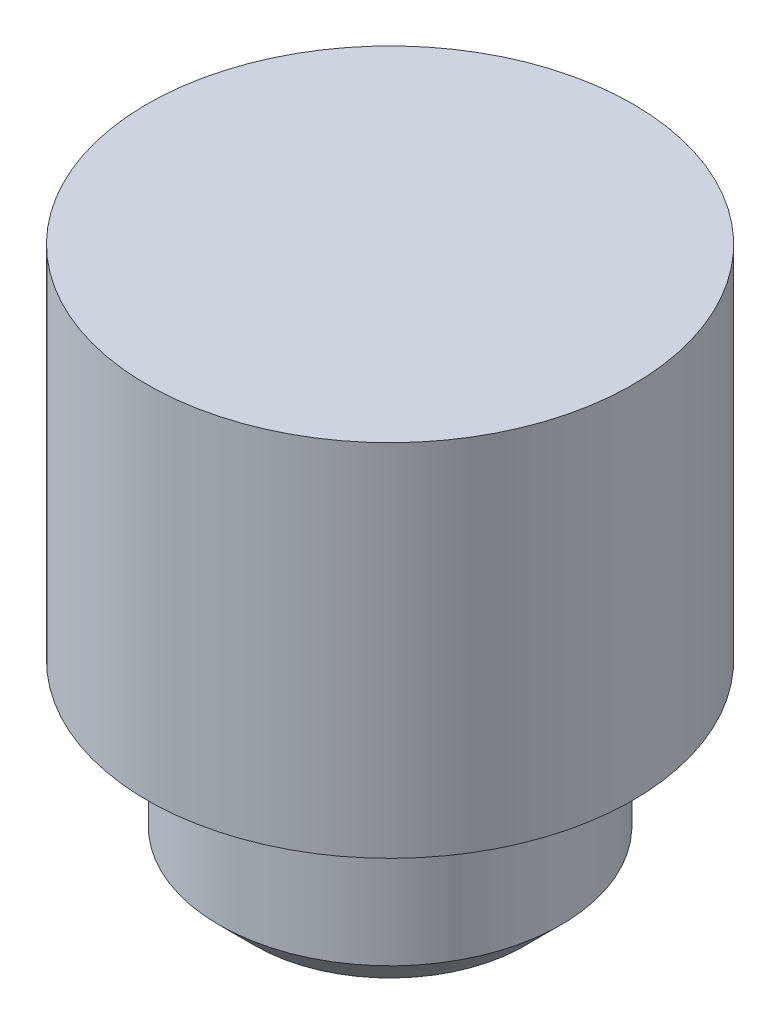
ISO-10303-21;
HEADER;
FILE_DESCRIPTION(('STEP AP214'),'2;1');
FILE_NAME('part.step','',(''),(''),'','','');
FILE_SCHEMA(('AUTOMOTIVE_DESIGN { 1 0 10303 214 1 1 1 1 }'));
ENDSEC;
DATA;
#1=APPLICATION_CONTEXT('core data for automotive mechanical design processes');
#2=APPLICATION_PROTOCOL_DEFINITION('international standard','automotive_design',2000,#1);
#3=PRODUCT_CONTEXT('',#1,'mechanical');
#4=PRODUCT('Part','Part','',(#3));
#5=PRODUCT_RELATED_PRODUCT_CATEGORY('part','',(#4));
#6=PRODUCT_DEFINITION_FORMATION('','',#4);
#7=PRODUCT_DEFINITION_CONTEXT('part definition',#1,'design');
#8=PRODUCT_DEFINITION('design','',#6,#7);
#9=PRODUCT_DEFINITION_SHAPE('','',#8);
#10=(LENGTH_UNIT() NAMED_UNIT(*) SI_UNIT(.MILLI.,.METRE.));
#11=(NAMED_UNIT(*) PLANE_ANGLE_UNIT() SI_UNIT($,.RADIAN.));
#12=(NAMED_UNIT(*) SI_UNIT($,.STERADIAN.) SOLID_ANGLE_UNIT());
#13=UNCERTAINTY_MEASURE_WITH_UNIT(LENGTH_MEASURE(1.E-05),#10,'distance_accuracy_value','');
#14=(GEOMETRIC_REPRESENTATION_CONTEXT(3) GLOBAL_UNCERTAINTY_ASSIGNED_CONTEXT((#13)) GLOBAL_UNIT_ASSIGNED_CONTEXT((#10,
#11,#12)) REPRESENTATION_CONTEXT('',''));
#15=CARTESIAN_POINT('',(0.,0.,0.));
#16=DIRECTION('',(0.,0.,1.));
#17=DIRECTION('',(1.,0.,0.));
#18=AXIS2_PLACEMENT_3D('',#15,#16,#17);
#19=CARTESIAN_POINT('',(4.75,-7.5,0.));
#20=DIRECTION('',(0.,-1.,0.));
#21=DIRECTION('',(0.,0.,-1.));
#22=AXIS2_PLACEMENT_3D('',#19,#20,#21);
#23=PLANE('',#22);
#24=CARTESIAN_POINT('',(0.,-7.5,0.));
#25=DIRECTION('',(0.,-1.,0.));
#26=DIRECTION('',(0.,0.,-1.));
#27=AXIS2_PLACEMENT_3D('',#24,#25,#26);
#28=CIRCLE('',#27,3.75);
#29=CARTESIAN_POINT('',(0.,-7.5,-3.75));
#30=VERTEX_POINT('',#29);
#31=EDGE_CURVE('E45',#30,#30,#28,.T.);
#32=ORIENTED_EDGE('',*,*,#31,.T.);
#33=EDGE_LOOP('',(#32));
#34=FACE_BOUND('',#33,.T.);
#35=ADVANCED_FACE('F37',(#34),#23,.T.);
#36=CARTESIAN_POINT('',(0.,7.5,0.));
#37=DIRECTION('',(0.,1.,0.));
#38=DIRECTION('',(0.,0.,1.));
#39=AXIS2_PLACEMENT_3D('',#36,#37,#38);
#40=PLANE('',#39);
#41=CARTESIAN_POINT('',(0.,7.5,0.));
#42=DIRECTION('',(0.,-1.,0.));
#43=DIRECTION('',(0.,0.,-1.));
#44=AXIS2_PLACEMENT_3D('',#41,#42,#43);
#45=CIRCLE('',#44,6.75000000000001);
#46=CARTESIAN_POINT('',(0.,7.5,-6.75000000000001));
#47=VERTEX_POINT('',#46);
#48=EDGE_CURVE('E50',#47,#47,#45,.T.);
#49=ORIENTED_EDGE('',*,*,#48,.F.);
#50=EDGE_LOOP('',(#49));
#51=FACE_BOUND('',#50,.T.);
#52=ADVANCED_FACE('F78',(#51),#40,.T.);
#53=CARTESIAN_POINT('',(0.,-27.6984126984377,0.));
#54=DIRECTION('',(0.,-1.,0.));
#55=DIRECTION('',(0.,0.,-1.));
#56=AXIS2_PLACEMENT_3D('',#53,#54,#55);
#57=CYLINDRICAL_SURFACE('',#56,6.75000000000001);
#58=ORIENTED_EDGE('',*,*,#48,.T.);
#59=EDGE_LOOP('',(#58));
#60=FACE_BOUND('',#59,.T.);
#61=CARTESIAN_POINT('',(0.,-2.5,0.));
#62=DIRECTION('',(0.,-1.,0.));
#63=DIRECTION('',(0.,0.,-1.));
#64=AXIS2_PLACEMENT_3D('',#61,#62,#63);
#65=CIRCLE('',#64,6.75000000000001);
#66=CARTESIAN_POINT('',(0.,-2.5,-6.75000000000001));
#67=VERTEX_POINT('',#66);
#68=EDGE_CURVE('E55',#67,#67,#65,.T.);
#69=ORIENTED_EDGE('',*,*,#68,.F.);
#70=EDGE_LOOP('',(#69));
#71=FACE_BOUND('',#70,.T.);
#72=ADVANCED_FACE('F70',(#60,#71),#57,.T.);
#73=CARTESIAN_POINT('',(6.75000000000001,-2.5,0.));
#74=DIRECTION('',(0.,-1.,0.));
#75=DIRECTION('',(0.,0.,-1.));
#76=AXIS2_PLACEMENT_3D('',#73,#74,#75);
#77=PLANE('',#76);
#78=ORIENTED_EDGE('',*,*,#68,.T.);
#79=EDGE_LOOP('',(#78));
#80=FACE_BOUND('',#79,.T.);
#81=CARTESIAN_POINT('',(0.,-2.5,0.));
#82=DIRECTION('',(0.,-1.,0.));
#83=DIRECTION('',(0.,0.,-1.));
#84=AXIS2_PLACEMENT_3D('',#81,#82,#83);
#85=CIRCLE('',#84,4.75);
#86=CARTESIAN_POINT('',(0.,-2.5,-4.75));
#87=VERTEX_POINT('',#86);
#88=EDGE_CURVE('E61',#87,#87,#85,.T.);
#89=ORIENTED_EDGE('',*,*,#88,.F.);
#90=EDGE_LOOP('',(#89));
#91=FACE_BOUND('',#90,.T.);
#92=ADVANCED_FACE('F68',(#80,#91),#77,.T.);
#93=CARTESIAN_POINT('',(0.,-27.6984126984377,0.));
#94=DIRECTION('',(0.,-1.,0.));
#95=DIRECTION('',(0.,0.,-1.));
#96=AXIS2_PLACEMENT_3D('',#93,#94,#95);
#97=CYLINDRICAL_SURFACE('',#96,4.75);
#98=CARTESIAN_POINT('',(0.,-6.49999999999999,0.));
#99=DIRECTION('',(0.,-1.,0.));
#100=DIRECTION('',(0.,0.,-1.));
#101=AXIS2_PLACEMENT_3D('',#98,#99,#100);
#102=CIRCLE('',#101,4.75);
#103=CARTESIAN_POINT('',(0.,-6.49999999999999,-4.75));
#104=VERTEX_POINT('',#103);
#105=EDGE_CURVE('E10',#104,#104,#102,.F.);
#106=ORIENTED_EDGE('',*,*,#105,.T.);
#107=EDGE_LOOP('',(#106));
#108=FACE_BOUND('',#107,.T.);
#109=ORIENTED_EDGE('',*,*,#88,.T.);
#110=EDGE_LOOP('',(#109));
#111=FACE_BOUND('',#110,.T.);
#112=ADVANCED_FACE('F66',(#108,#111),#97,.T.);
#113=CARTESIAN_POINT('',(0.,-7.5,0.));
#114=DIRECTION('',(0.,1.,0.));
#115=DIRECTION('',(0.,0.,1.));
#116=AXIS2_PLACEMENT_3D('',#113,#114,#115);
#117=CONICAL_SURFACE('',#116,3.75,0.785398163397444);
#118=ORIENTED_EDGE('',*,*,#105,.F.);
#119=EDGE_LOOP('',(#118));
#120=FACE_BOUND('',#119,.T.);
#121=ORIENTED_EDGE('',*,*,#31,.F.);
#122=EDGE_LOOP('',(#121));
#123=FACE_BOUND('',#122,.T.);
#124=ADVANCED_FACE('F39',(#120,#123),#117,.T.);
#125=CLOSED_SHELL('',(#35,#52,#72,#92,#112,#124));
#126=MANIFOLD_SOLID_BREP('B2',#125);
#127=ADVANCED_BREP_SHAPE_REPRESENTATION('',(#18,#126),#14);
#128=SHAPE_DEFINITION_REPRESENTATION(#9,#127);
ENDSEC;
END-ISO-10303-21;
